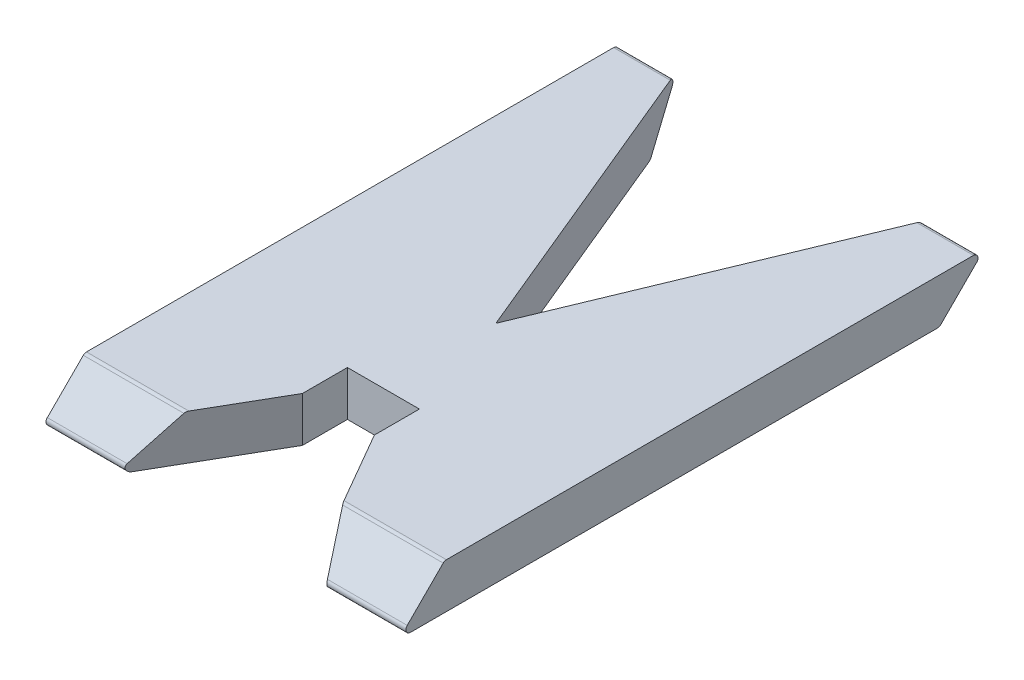
ISO-10303-21;
HEADER;
FILE_DESCRIPTION(('STEP AP214'),'2;1');
FILE_NAME('part.step','',(''),(''),'','','');
FILE_SCHEMA(('AUTOMOTIVE_DESIGN { 1 0 10303 214 1 1 1 1 }'));
ENDSEC;
DATA;
#1=APPLICATION_CONTEXT('core data for automotive mechanical design processes');
#2=APPLICATION_PROTOCOL_DEFINITION('international standard','automotive_design',2000,#1);
#3=PRODUCT_CONTEXT('',#1,'mechanical');
#4=PRODUCT('Part','Part','',(#3));
#5=PRODUCT_RELATED_PRODUCT_CATEGORY('part','',(#4));
#6=PRODUCT_DEFINITION_FORMATION('','',#4);
#7=PRODUCT_DEFINITION_CONTEXT('part definition',#1,'design');
#8=PRODUCT_DEFINITION('design','',#6,#7);
#9=PRODUCT_DEFINITION_SHAPE('','',#8);
#10=(LENGTH_UNIT() NAMED_UNIT(*) SI_UNIT(.MILLI.,.METRE.));
#11=(NAMED_UNIT(*) PLANE_ANGLE_UNIT() SI_UNIT($,.RADIAN.));
#12=(NAMED_UNIT(*) SI_UNIT($,.STERADIAN.) SOLID_ANGLE_UNIT());
#13=UNCERTAINTY_MEASURE_WITH_UNIT(LENGTH_MEASURE(1.E-05),#10,'distance_accuracy_value','');
#14=(GEOMETRIC_REPRESENTATION_CONTEXT(3) GLOBAL_UNCERTAINTY_ASSIGNED_CONTEXT((#13)) GLOBAL_UNIT_ASSIGNED_CONTEXT((#10,
#11,#12)) REPRESENTATION_CONTEXT('',''));
#15=CARTESIAN_POINT('',(0.,0.,0.));
#16=DIRECTION('',(0.,0.,1.));
#17=DIRECTION('',(1.,0.,0.));
#18=AXIS2_PLACEMENT_3D('',#15,#16,#17);
#19=CARTESIAN_POINT('',(0.,10.,-10.));
#20=DIRECTION('',(0.,0.707106781186547,0.707106781186549));
#21=DIRECTION('',(-1.,0.,0.));
#22=AXIS2_PLACEMENT_3D('',#19,#20,#21);
#23=PLANE('',#22);
#24=DIRECTION('',(-0.377964473009225,0.654653670707979,-0.654653670707977));
#25=VECTOR('',#24,1.);
#26=CARTESIAN_POINT('',(49.2657862446619,24.221807475097,-24.2218074750969));
#27=LINE('',#26,#25);
#28=CARTESIAN_POINT('',(62.2646547510148,1.70710678118655,-1.70710678118658));
#29=VERTEX_POINT('',#28);
#30=CARTESIAN_POINT('',(57.6458525974978,9.70710678118655,-9.70710678118656));
#31=VERTEX_POINT('',#30);
#32=EDGE_CURVE('E285',#29,#31,#27,.T.);
#33=ORIENTED_EDGE('',*,*,#32,.F.);
#34=DIRECTION('',(1.,0.,0.));
#35=VECTOR('',#34,1.);
#36=CARTESIAN_POINT('',(80.,1.70710678118655,-1.70710678118658));
#37=LINE('',#36,#35);
#38=CARTESIAN_POINT('',(80.,1.70710678118655,-1.70710678118658));
#39=VERTEX_POINT('',#38);
#40=EDGE_CURVE('E315',#29,#39,#37,.T.);
#41=ORIENTED_EDGE('',*,*,#40,.T.);
#42=DIRECTION('',(0.,-0.707106781186549,0.707106781186547));
#43=VECTOR('',#42,1.);
#44=CARTESIAN_POINT('',(80.,10.,-10.));
#45=LINE('',#44,#43);
#46=CARTESIAN_POINT('',(80.,9.70710678118655,-9.70710678118656));
#47=VERTEX_POINT('',#46);
#48=EDGE_CURVE('E301',#47,#39,#45,.T.);
#49=ORIENTED_EDGE('',*,*,#48,.F.);
#50=DIRECTION('',(1.,0.,0.));
#51=VECTOR('',#50,1.);
#52=CARTESIAN_POINT('',(0.,9.70710678118655,-9.70710678118656));
#53=LINE('',#52,#51);
#54=EDGE_CURVE('E338',#47,#31,#53,.F.);
#55=ORIENTED_EDGE('',*,*,#54,.T.);
#56=EDGE_LOOP('',(#33,#41,#49,#55));
#57=FACE_BOUND('',#56,.T.);
#58=ADVANCED_FACE('F47',(#57),#23,.T.);
#59=CARTESIAN_POINT('',(0.,1.,-2.41421356237313));
#60=DIRECTION('',(-1.,0.,0.));
#61=DIRECTION('',(0.,0.,1.));
#62=AXIS2_PLACEMENT_3D('',#59,#60,#61);
#63=CYLINDRICAL_SURFACE('',#62,1.);
#64=CARTESIAN_POINT('',(61.8564064605509,1.,-2.41421356237313));
#65=DIRECTION('',(0.86602540378444,0.,-0.499999999999998));
#66=DIRECTION('',(-0.499999999999998,0.,-0.86602540378444));
#67=AXIS2_PLACEMENT_3D('',#64,#65,#66);
#68=ELLIPSE('',#67,1.15470053837925,1.);
#69=CARTESIAN_POINT('',(61.8564064605509,0.,-2.41421356237313));
#70=VERTEX_POINT('',#69);
#71=EDGE_CURVE('E288',#70,#29,#68,.F.);
#72=ORIENTED_EDGE('',*,*,#71,.F.);
#73=DIRECTION('',(1.,0.,0.));
#74=VECTOR('',#73,1.);
#75=CARTESIAN_POINT('',(0.,0.,-2.41421356237313));
#76=LINE('',#75,#74);
#77=CARTESIAN_POINT('',(80.,0.,-2.41421356237313));
#78=VERTEX_POINT('',#77);
#79=EDGE_CURVE('E324',#78,#70,#76,.F.);
#80=ORIENTED_EDGE('',*,*,#79,.F.);
#81=CARTESIAN_POINT('',(80.,1.,-2.41421356237313));
#82=DIRECTION('',(-1.,0.,0.));
#83=DIRECTION('',(0.,0.,1.));
#84=AXIS2_PLACEMENT_3D('',#81,#82,#83);
#85=CIRCLE('',#84,1.);
#86=EDGE_CURVE('E320',#39,#78,#85,.F.);
#87=ORIENTED_EDGE('',*,*,#86,.F.);
#88=ORIENTED_EDGE('',*,*,#40,.F.);
#89=EDGE_LOOP('',(#72,#80,#87,#88));
#90=FACE_BOUND('',#89,.T.);
#91=ADVANCED_FACE('F418',(#90),#63,.T.);
#92=CARTESIAN_POINT('',(0.,9.,-10.4142135623731));
#93=DIRECTION('',(1.,0.,0.));
#94=DIRECTION('',(0.,0.,-1.));
#95=AXIS2_PLACEMENT_3D('',#92,#93,#94);
#96=CYLINDRICAL_SURFACE('',#95,1.);
#97=CARTESIAN_POINT('',(57.237604307034,9.,-10.4142135623731));
#98=DIRECTION('',(0.86602540378444,0.,-0.499999999999998));
#99=DIRECTION('',(0.499999999999998,0.,0.86602540378444));
#100=AXIS2_PLACEMENT_3D('',#97,#98,#99);
#101=ELLIPSE('',#100,1.15470053837925,1.);
#102=CARTESIAN_POINT('',(57.237604307034,10.,-10.4142135623731));
#103=VERTEX_POINT('',#102);
#104=EDGE_CURVE('E11',#31,#103,#101,.F.);
#105=ORIENTED_EDGE('',*,*,#104,.F.);
#106=ORIENTED_EDGE('',*,*,#54,.F.);
#107=CARTESIAN_POINT('',(80.,9.,-10.4142135623731));
#108=DIRECTION('',(-1.,0.,0.));
#109=DIRECTION('',(0.,0.,1.));
#110=AXIS2_PLACEMENT_3D('',#107,#108,#109);
#111=CIRCLE('',#110,1.);
#112=CARTESIAN_POINT('',(80.,10.,-10.4142135623731));
#113=VERTEX_POINT('',#112);
#114=EDGE_CURVE('E334',#113,#47,#111,.F.);
#115=ORIENTED_EDGE('',*,*,#114,.F.);
#116=DIRECTION('',(1.,0.,0.));
#117=VECTOR('',#116,1.);
#118=CARTESIAN_POINT('',(0.,10.,-10.4142135623731));
#119=LINE('',#118,#117);
#120=EDGE_CURVE('E331',#103,#113,#119,.T.);
#121=ORIENTED_EDGE('',*,*,#120,.F.);
#122=EDGE_LOOP('',(#105,#106,#115,#121));
#123=FACE_BOUND('',#122,.T.);
#124=ADVANCED_FACE('F475',(#123),#96,.T.);
#125=CARTESIAN_POINT('',(0.,0.,-120.));
#126=DIRECTION('',(0.,-0.707106781186547,-0.707106781186548));
#127=DIRECTION('',(-1.,0.,0.));
#128=AXIS2_PLACEMENT_3D('',#125,#126,#127);
#129=PLANE('',#128);
#130=DIRECTION('',(-0.281084637714818,0.678598344545848,-0.678598344545847));
#131=VECTOR('',#130,1.);
#132=CARTESIAN_POINT('',(14.4899329647434,3.00096337593684,-123.000963375937));
#133=LINE('',#132,#131);
#134=CARTESIAN_POINT('',(15.6116523516818,0.292893218813456,-120.292893218813));
#135=VERTEX_POINT('',#134);
#136=CARTESIAN_POINT('',(12.297943852697,8.29289321881346,-128.292893218813));
#137=VERTEX_POINT('',#136);
#138=EDGE_CURVE('E272',#135,#137,#133,.T.);
#139=ORIENTED_EDGE('',*,*,#138,.F.);
#140=DIRECTION('',(1.,0.,0.));
#141=VECTOR('',#140,1.);
#142=CARTESIAN_POINT('',(0.,0.292893218813456,-120.292893218813));
#143=LINE('',#142,#141);
#144=CARTESIAN_POINT('',(0.,0.292893218813463,-120.292893218813));
#145=VERTEX_POINT('',#144);
#146=EDGE_CURVE('E361',#135,#145,#143,.F.);
#147=ORIENTED_EDGE('',*,*,#146,.T.);
#148=DIRECTION('',(0.,-0.707106781186548,0.707106781186547));
#149=VECTOR('',#148,1.);
#150=CARTESIAN_POINT('',(0.,-55.,-65.0000000000001));
#151=LINE('',#150,#149);
#152=CARTESIAN_POINT('',(0.,8.29289321881346,-128.292893218813));
#153=VERTEX_POINT('',#152);
#154=EDGE_CURVE('E349',#153,#145,#151,.T.);
#155=ORIENTED_EDGE('',*,*,#154,.F.);
#156=DIRECTION('',(1.,0.,0.));
#157=VECTOR('',#156,1.);
#158=CARTESIAN_POINT('',(0.,8.29289321881346,-128.292893218813));
#159=LINE('',#158,#157);
#160=EDGE_CURVE('E370',#153,#137,#159,.T.);
#161=ORIENTED_EDGE('',*,*,#160,.T.);
#162=EDGE_LOOP('',(#139,#147,#155,#161));
#163=FACE_BOUND('',#162,.T.);
#164=ADVANCED_FACE('F462',(#163),#129,.T.);
#165=CARTESIAN_POINT('',(0.,1.,-119.585786437627));
#166=DIRECTION('',(-1.,0.,0.));
#167=DIRECTION('',(0.,0.,1.));
#168=AXIS2_PLACEMENT_3D('',#165,#166,#167);
#169=CYLINDRICAL_SURFACE('',#168,1.);
#170=CARTESIAN_POINT('',(15.9045455704952,1.,-119.585786437627));
#171=DIRECTION('',(-0.923879532511288,0.,0.382683432365087));
#172=DIRECTION('',(-0.382683432365087,0.,-0.923879532511288));
#173=AXIS2_PLACEMENT_3D('',#170,#171,#172);
#174=ELLIPSE('',#173,1.08239220029239,1.);
#175=CARTESIAN_POINT('',(15.9045455704952,0.,-119.585786437627));
#176=VERTEX_POINT('',#175);
#177=EDGE_CURVE('E275',#176,#135,#174,.F.);
#178=ORIENTED_EDGE('',*,*,#177,.F.);
#179=DIRECTION('',(1.,0.,0.));
#180=VECTOR('',#179,1.);
#181=CARTESIAN_POINT('',(80.,0.,-119.585786437627));
#182=LINE('',#181,#180);
#183=CARTESIAN_POINT('',(0.,0.,-119.585786437627));
#184=VERTEX_POINT('',#183);
#185=EDGE_CURVE('E354',#184,#176,#182,.T.);
#186=ORIENTED_EDGE('',*,*,#185,.F.);
#187=CARTESIAN_POINT('',(0.,1.,-119.585786437627));
#188=DIRECTION('',(-1.,0.,0.));
#189=DIRECTION('',(0.,0.,1.));
#190=AXIS2_PLACEMENT_3D('',#187,#188,#189);
#191=CIRCLE('',#190,1.);
#192=EDGE_CURVE('E366',#145,#184,#191,.T.);
#193=ORIENTED_EDGE('',*,*,#192,.F.);
#194=ORIENTED_EDGE('',*,*,#146,.F.);
#195=EDGE_LOOP('',(#178,#186,#193,#194));
#196=FACE_BOUND('',#195,.T.);
#197=ADVANCED_FACE('F446',(#196),#169,.T.);
#198=CARTESIAN_POINT('',(0.,9.,-127.585786437627));
#199=DIRECTION('',(1.,0.,0.));
#200=DIRECTION('',(0.,0.,-1.));
#201=AXIS2_PLACEMENT_3D('',#198,#199,#200);
#202=CYLINDRICAL_SURFACE('',#201,1.);
#203=DIRECTION('',(1.,0.,0.));
#204=VECTOR('',#203,1.);
#205=CARTESIAN_POINT('',(0.,10.,-127.585786437627));
#206=LINE('',#205,#204);
#207=CARTESIAN_POINT('',(12.5908370715105,10.,-127.585786437627));
#208=VERTEX_POINT('',#207);
#209=CARTESIAN_POINT('',(0.,10.,-127.585786437627));
#210=VERTEX_POINT('',#209);
#211=EDGE_CURVE('E377',#208,#210,#206,.F.);
#212=ORIENTED_EDGE('',*,*,#211,.F.);
#213=CARTESIAN_POINT('',(12.5908370715105,9.,-127.585786437627));
#214=DIRECTION('',(-0.923879532511288,0.,0.382683432365087));
#215=DIRECTION('',(0.382683432365087,0.,0.923879532511288));
#216=AXIS2_PLACEMENT_3D('',#213,#214,#215);
#217=ELLIPSE('',#216,1.08239220029239,1.);
#218=EDGE_CURVE('E388',#137,#208,#217,.F.);
#219=ORIENTED_EDGE('',*,*,#218,.F.);
#220=ORIENTED_EDGE('',*,*,#160,.F.);
#221=CARTESIAN_POINT('',(0.,9.,-127.585786437627));
#222=DIRECTION('',(-1.,0.,0.));
#223=DIRECTION('',(0.,0.,1.));
#224=AXIS2_PLACEMENT_3D('',#221,#222,#223);
#225=CIRCLE('',#224,1.);
#226=EDGE_CURVE('E382',#210,#153,#225,.T.);
#227=ORIENTED_EDGE('',*,*,#226,.F.);
#228=EDGE_LOOP('',(#212,#219,#220,#227));
#229=FACE_BOUND('',#228,.T.);
#230=ADVANCED_FACE('F461',(#229),#202,.T.);
#231=CARTESIAN_POINT('',(80.,10.,0.));
#232=DIRECTION('',(-1.,0.,0.));
#233=DIRECTION('',(0.,0.,1.));
#234=AXIS2_PLACEMENT_3D('',#231,#232,#233);
#235=PLANE('',#234);
#236=DIRECTION('',(0.,0.707106781186548,-0.707106781186547));
#237=VECTOR('',#236,1.);
#238=CARTESIAN_POINT('',(80.,0.,-120.));
#239=LINE('',#238,#237);
#240=CARTESIAN_POINT('',(80.,0.292893218813456,-120.292893218813));
#241=VERTEX_POINT('',#240);
#242=CARTESIAN_POINT('',(80.,8.29289321881346,-128.292893218813));
#243=VERTEX_POINT('',#242);
#244=EDGE_CURVE('E345',#241,#243,#239,.T.);
#245=ORIENTED_EDGE('',*,*,#244,.T.);
#246=CARTESIAN_POINT('',(80.,9.,-127.585786437627));
#247=DIRECTION('',(-1.,0.,0.));
#248=DIRECTION('',(0.,0.,1.));
#249=AXIS2_PLACEMENT_3D('',#246,#247,#248);
#250=CIRCLE('',#249,1.);
#251=CARTESIAN_POINT('',(80.,10.,-127.585786437627));
#252=VERTEX_POINT('',#251);
#253=EDGE_CURVE('E374',#243,#252,#250,.F.);
#254=ORIENTED_EDGE('',*,*,#253,.T.);
#255=DIRECTION('',(0.,0.,-1.));
#256=VECTOR('',#255,1.);
#257=CARTESIAN_POINT('',(80.,10.,0.));
#258=LINE('',#257,#256);
#259=EDGE_CURVE('E292',#113,#252,#258,.T.);
#260=ORIENTED_EDGE('',*,*,#259,.F.);
#261=ORIENTED_EDGE('',*,*,#114,.T.);
#262=ORIENTED_EDGE('',*,*,#48,.T.);
#263=ORIENTED_EDGE('',*,*,#86,.T.);
#264=DIRECTION('',(0.,0.,-1.));
#265=VECTOR('',#264,1.);
#266=CARTESIAN_POINT('',(80.,0.,0.));
#267=LINE('',#266,#265);
#268=CARTESIAN_POINT('',(80.,0.,-119.585786437627));
#269=VERTEX_POINT('',#268);
#270=EDGE_CURVE('E291',#78,#269,#267,.T.);
#271=ORIENTED_EDGE('',*,*,#270,.T.);
#272=CARTESIAN_POINT('',(80.,1.,-119.585786437627));
#273=DIRECTION('',(-1.,0.,0.));
#274=DIRECTION('',(0.,0.,1.));
#275=AXIS2_PLACEMENT_3D('',#272,#273,#274);
#276=CIRCLE('',#275,1.);
#277=EDGE_CURVE('E358',#269,#241,#276,.F.);
#278=ORIENTED_EDGE('',*,*,#277,.T.);
#279=EDGE_LOOP('',(#245,#254,#260,#261,#262,#263,#271,#278));
#280=FACE_BOUND('',#279,.T.);
#281=ADVANCED_FACE('F413',(#280),#235,.F.);
#282=CARTESIAN_POINT('',(0.,10.,0.));
#283=DIRECTION('',(-1.,0.,0.));
#284=DIRECTION('',(0.,0.,1.));
#285=AXIS2_PLACEMENT_3D('',#282,#283,#284);
#286=PLANE('',#285);
#287=DIRECTION('',(0.,0.,-1.));
#288=VECTOR('',#287,1.);
#289=CARTESIAN_POINT('',(0.,10.,0.));
#290=LINE('',#289,#288);
#291=CARTESIAN_POINT('',(0.,10.,-10.4142135623731));
#292=VERTEX_POINT('',#291);
#293=EDGE_CURVE('E296',#292,#210,#290,.T.);
#294=ORIENTED_EDGE('',*,*,#293,.T.);
#295=ORIENTED_EDGE('',*,*,#226,.T.);
#296=ORIENTED_EDGE('',*,*,#154,.T.);
#297=ORIENTED_EDGE('',*,*,#192,.T.);
#298=DIRECTION('',(0.,0.,-1.));
#299=VECTOR('',#298,1.);
#300=CARTESIAN_POINT('',(0.,0.,0.));
#301=LINE('',#300,#299);
#302=CARTESIAN_POINT('',(0.,0.,-2.41421356237313));
#303=VERTEX_POINT('',#302);
#304=EDGE_CURVE('E297',#303,#184,#301,.T.);
#305=ORIENTED_EDGE('',*,*,#304,.F.);
#306=CARTESIAN_POINT('',(0.,1.,-2.41421356237313));
#307=DIRECTION('',(-1.,0.,0.));
#308=DIRECTION('',(0.,0.,1.));
#309=AXIS2_PLACEMENT_3D('',#306,#307,#308);
#310=CIRCLE('',#309,1.);
#311=CARTESIAN_POINT('',(0.,1.70710678118655,-1.70710678118658));
#312=VERTEX_POINT('',#311);
#313=EDGE_CURVE('E328',#303,#312,#310,.T.);
#314=ORIENTED_EDGE('',*,*,#313,.T.);
#315=DIRECTION('',(0.,0.707106781186549,-0.707106781186547));
#316=VECTOR('',#315,1.);
#317=CARTESIAN_POINT('',(0.,4.99999999999999,-5.00000000000002));
#318=LINE('',#317,#316);
#319=CARTESIAN_POINT('',(0.,9.70710678118655,-9.70710678118656));
#320=VERTEX_POINT('',#319);
#321=EDGE_CURVE('E311',#312,#320,#318,.T.);
#322=ORIENTED_EDGE('',*,*,#321,.T.);
#323=CARTESIAN_POINT('',(0.,9.,-10.4142135623731));
#324=DIRECTION('',(-1.,0.,0.));
#325=DIRECTION('',(0.,0.,1.));
#326=AXIS2_PLACEMENT_3D('',#323,#324,#325);
#327=CIRCLE('',#326,1.);
#328=EDGE_CURVE('E342',#320,#292,#327,.T.);
#329=ORIENTED_EDGE('',*,*,#328,.T.);
#330=EDGE_LOOP('',(#294,#295,#296,#297,#305,#314,#322,#329));
#331=FACE_BOUND('',#330,.T.);
#332=ADVANCED_FACE('F459',(#331),#286,.T.);
#333=CARTESIAN_POINT('',(0.,10.,0.));
#334=DIRECTION('',(0.,1.,0.));
#335=DIRECTION('',(0.,0.,1.));
#336=AXIS2_PLACEMENT_3D('',#333,#334,#335);
#337=PLANE('',#336);
#338=DIRECTION('',(0.499999999999998,0.,0.86602540378444));
#339=VECTOR('',#338,1.);
#340=CARTESIAN_POINT('',(48.,10.,-26.4142135623731));
#341=LINE('',#340,#339);
#342=CARTESIAN_POINT('',(48.,10.,-26.4142135623731));
#343=VERTEX_POINT('',#342);
#344=EDGE_CURVE('E198',#343,#103,#341,.T.);
#345=ORIENTED_EDGE('',*,*,#344,.T.);
#346=ORIENTED_EDGE('',*,*,#120,.T.);
#347=ORIENTED_EDGE('',*,*,#259,.T.);
#348=CARTESIAN_POINT('',(67.4091629284896,10.,-127.585786437627));
#349=VERTEX_POINT('',#348);
#350=EDGE_CURVE('E378',#252,#349,#206,.F.);
#351=ORIENTED_EDGE('',*,*,#350,.T.);
#352=DIRECTION('',(-0.382683432365087,0.,0.923879532511288));
#353=VECTOR('',#352,1.);
#354=CARTESIAN_POINT('',(40.,10.,-61.4142135623731));
#355=LINE('',#354,#353);
#356=CARTESIAN_POINT('',(40.,10.,-61.4142135623731));
#357=VERTEX_POINT('',#356);
#358=EDGE_CURVE('E71',#349,#357,#355,.T.);
#359=ORIENTED_EDGE('',*,*,#358,.T.);
#360=DIRECTION('',(-0.382683432365087,0.,-0.923879532511288));
#361=VECTOR('',#360,1.);
#362=CARTESIAN_POINT('',(12.1766235091374,10.,-128.585786437627));
#363=LINE('',#362,#361);
#364=EDGE_CURVE('E256',#357,#208,#363,.T.);
#365=ORIENTED_EDGE('',*,*,#364,.T.);
#366=ORIENTED_EDGE('',*,*,#211,.T.);
#367=ORIENTED_EDGE('',*,*,#293,.F.);
#368=CARTESIAN_POINT('',(22.762395692966,10.,-10.4142135623731));
#369=VERTEX_POINT('',#368);
#370=EDGE_CURVE('E214',#292,#369,#119,.T.);
#371=ORIENTED_EDGE('',*,*,#370,.T.);
#372=DIRECTION('',(0.499999999999998,0.,-0.86602540378444));
#373=VECTOR('',#372,1.);
#374=CARTESIAN_POINT('',(17.5662432702594,10.,-1.41421356237312));
#375=LINE('',#374,#373);
#376=CARTESIAN_POINT('',(32.,10.,-26.4142135623731));
#377=VERTEX_POINT('',#376);
#378=EDGE_CURVE('E63',#369,#377,#375,.T.);
#379=ORIENTED_EDGE('',*,*,#378,.T.);
#380=DIRECTION('',(0.,0.,-1.));
#381=VECTOR('',#380,1.);
#382=CARTESIAN_POINT('',(32.,10.,-26.4142135623731));
#383=LINE('',#382,#381);
#384=CARTESIAN_POINT('',(32.,10.,-36.4142135623731));
#385=VERTEX_POINT('',#384);
#386=EDGE_CURVE('E201',#377,#385,#383,.T.);
#387=ORIENTED_EDGE('',*,*,#386,.T.);
#388=DIRECTION('',(1.,0.,0.));
#389=VECTOR('',#388,1.);
#390=CARTESIAN_POINT('',(32.,10.,-36.4142135623731));
#391=LINE('',#390,#389);
#392=CARTESIAN_POINT('',(48.,10.,-36.4142135623731));
#393=VERTEX_POINT('',#392);
#394=EDGE_CURVE('E207',#385,#393,#391,.T.);
#395=ORIENTED_EDGE('',*,*,#394,.T.);
#396=DIRECTION('',(0.,0.,1.));
#397=VECTOR('',#396,1.);
#398=CARTESIAN_POINT('',(48.,10.,-36.4142135623731));
#399=LINE('',#398,#397);
#400=EDGE_CURVE('E224',#393,#343,#399,.T.);
#401=ORIENTED_EDGE('',*,*,#400,.T.);
#402=EDGE_LOOP('',(#345,#346,#347,#351,#359,#365,#366,#367,#371,#379,#387,#395,#401));
#403=FACE_BOUND('',#402,.T.);
#404=ADVANCED_FACE('F211',(#403),#337,.T.);
#405=CARTESIAN_POINT('',(0.,0.,0.));
#406=DIRECTION('',(0.,1.,0.));
#407=DIRECTION('',(0.,0.,1.));
#408=AXIS2_PLACEMENT_3D('',#405,#406,#407);
#409=PLANE('',#408);
#410=ORIENTED_EDGE('',*,*,#79,.T.);
#411=DIRECTION('',(0.499999999999998,0.,0.86602540378444));
#412=VECTOR('',#411,1.);
#413=CARTESIAN_POINT('',(48.,0.,-26.4142135623731));
#414=LINE('',#413,#412);
#415=CARTESIAN_POINT('',(48.,0.,-26.4142135623731));
#416=VERTEX_POINT('',#415);
#417=EDGE_CURVE('E216',#416,#70,#414,.T.);
#418=ORIENTED_EDGE('',*,*,#417,.F.);
#419=DIRECTION('',(0.,0.,1.));
#420=VECTOR('',#419,1.);
#421=CARTESIAN_POINT('',(48.,0.,-36.4142135623731));
#422=LINE('',#421,#420);
#423=CARTESIAN_POINT('',(48.,0.,-36.4142135623731));
#424=VERTEX_POINT('',#423);
#425=EDGE_CURVE('E219',#424,#416,#422,.T.);
#426=ORIENTED_EDGE('',*,*,#425,.F.);
#427=DIRECTION('',(1.,0.,0.));
#428=VECTOR('',#427,1.);
#429=CARTESIAN_POINT('',(32.,0.,-36.4142135623731));
#430=LINE('',#429,#428);
#431=CARTESIAN_POINT('',(32.,0.,-36.4142135623731));
#432=VERTEX_POINT('',#431);
#433=EDGE_CURVE('E236',#432,#424,#430,.T.);
#434=ORIENTED_EDGE('',*,*,#433,.F.);
#435=DIRECTION('',(0.,0.,-1.));
#436=VECTOR('',#435,1.);
#437=CARTESIAN_POINT('',(32.,0.,-26.4142135623731));
#438=LINE('',#437,#436);
#439=CARTESIAN_POINT('',(32.,0.,-26.4142135623731));
#440=VERTEX_POINT('',#439);
#441=EDGE_CURVE('E232',#440,#432,#438,.T.);
#442=ORIENTED_EDGE('',*,*,#441,.F.);
#443=DIRECTION('',(0.499999999999998,0.,-0.86602540378444));
#444=VECTOR('',#443,1.);
#445=CARTESIAN_POINT('',(17.5662432702594,0.,-1.41421356237312));
#446=LINE('',#445,#444);
#447=CARTESIAN_POINT('',(18.1435935394491,0.,-2.41421356237313));
#448=VERTEX_POINT('',#447);
#449=EDGE_CURVE('E192',#448,#440,#446,.T.);
#450=ORIENTED_EDGE('',*,*,#449,.F.);
#451=EDGE_CURVE('E323',#448,#303,#76,.F.);
#452=ORIENTED_EDGE('',*,*,#451,.T.);
#453=ORIENTED_EDGE('',*,*,#304,.T.);
#454=ORIENTED_EDGE('',*,*,#185,.T.);
#455=DIRECTION('',(-0.382683432365087,0.,-0.923879532511288));
#456=VECTOR('',#455,1.);
#457=CARTESIAN_POINT('',(12.1766235091374,0.,-128.585786437627));
#458=LINE('',#457,#456);
#459=CARTESIAN_POINT('',(40.,0.,-61.4142135623731));
#460=VERTEX_POINT('',#459);
#461=EDGE_CURVE('E257',#460,#176,#458,.T.);
#462=ORIENTED_EDGE('',*,*,#461,.F.);
#463=DIRECTION('',(-0.382683432365087,0.,0.923879532511288));
#464=VECTOR('',#463,1.);
#465=CARTESIAN_POINT('',(40.,0.,-61.4142135623731));
#466=LINE('',#465,#464);
#467=CARTESIAN_POINT('',(64.0954544295048,0.,-119.585786437627));
#468=VERTEX_POINT('',#467);
#469=EDGE_CURVE('E233',#468,#460,#466,.T.);
#470=ORIENTED_EDGE('',*,*,#469,.F.);
#471=EDGE_CURVE('E353',#468,#269,#182,.T.);
#472=ORIENTED_EDGE('',*,*,#471,.T.);
#473=ORIENTED_EDGE('',*,*,#270,.F.);
#474=EDGE_LOOP('',(#410,#418,#426,#434,#442,#450,#452,#453,#454,#462,#470,#472,#473));
#475=FACE_BOUND('',#474,.T.);
#476=ADVANCED_FACE('F421',(#475),#409,.F.);
#477=DIRECTION('',(-0.377964473009225,-0.654653670707979,0.654653670707977));
#478=VECTOR('',#477,1.);
#479=CARTESIAN_POINT('',(19.3056423267668,4.42694110288129,-4.42694110288132));
#480=LINE('',#479,#478);
#481=CARTESIAN_POINT('',(22.3541474025022,9.70710678118655,-9.70710678118656));
#482=VERTEX_POINT('',#481);
#483=CARTESIAN_POINT('',(17.7353452489852,1.70710678118655,-1.70710678118658));
#484=VERTEX_POINT('',#483);
#485=EDGE_CURVE('E278',#482,#484,#480,.T.);
#486=ORIENTED_EDGE('',*,*,#485,.F.);
#487=EDGE_CURVE('E337',#482,#320,#53,.F.);
#488=ORIENTED_EDGE('',*,*,#487,.T.);
#489=ORIENTED_EDGE('',*,*,#321,.F.);
#490=EDGE_CURVE('E316',#312,#484,#37,.T.);
#491=ORIENTED_EDGE('',*,*,#490,.T.);
#492=EDGE_LOOP('',(#486,#488,#489,#491));
#493=FACE_BOUND('',#492,.T.);
#494=ADVANCED_FACE('F395',(#493),#23,.T.);
#495=CARTESIAN_POINT('',(18.1435935394491,1.,-2.41421356237313));
#496=DIRECTION('',(-0.86602540378444,0.,-0.499999999999998));
#497=DIRECTION('',(-0.499999999999998,0.,0.86602540378444));
#498=AXIS2_PLACEMENT_3D('',#495,#496,#497);
#499=ELLIPSE('',#498,1.15470053837925,1.);
#500=EDGE_CURVE('E282',#484,#448,#499,.F.);
#501=ORIENTED_EDGE('',*,*,#500,.F.);
#502=ORIENTED_EDGE('',*,*,#490,.F.);
#503=ORIENTED_EDGE('',*,*,#313,.F.);
#504=ORIENTED_EDGE('',*,*,#451,.F.);
#505=EDGE_LOOP('',(#501,#502,#503,#504));
#506=FACE_BOUND('',#505,.T.);
#507=ADVANCED_FACE('F467',(#506),#63,.T.);
#508=CARTESIAN_POINT('',(22.762395692966,9.,-10.4142135623731));
#509=DIRECTION('',(-0.86602540378444,0.,-0.499999999999998));
#510=DIRECTION('',(0.499999999999998,0.,-0.86602540378444));
#511=AXIS2_PLACEMENT_3D('',#508,#509,#510);
#512=ELLIPSE('',#511,1.15470053837925,1.);
#513=EDGE_CURVE('E56',#369,#482,#512,.F.);
#514=ORIENTED_EDGE('',*,*,#513,.F.);
#515=ORIENTED_EDGE('',*,*,#370,.F.);
#516=ORIENTED_EDGE('',*,*,#328,.F.);
#517=ORIENTED_EDGE('',*,*,#487,.F.);
#518=EDGE_LOOP('',(#514,#515,#516,#517));
#519=FACE_BOUND('',#518,.T.);
#520=ADVANCED_FACE('F399',(#519),#96,.T.);
#521=DIRECTION('',(-0.281084637714818,-0.678598344545848,0.678598344545847));
#522=VECTOR('',#521,1.);
#523=CARTESIAN_POINT('',(59.1893811505149,-12.2585222105068,-107.741477789493));
#524=LINE('',#523,#522);
#525=CARTESIAN_POINT('',(67.702056147303,8.29289321881346,-128.292893218813));
#526=VERTEX_POINT('',#525);
#527=CARTESIAN_POINT('',(64.3883476483183,0.292893218813456,-120.292893218813));
#528=VERTEX_POINT('',#527);
#529=EDGE_CURVE('E246',#526,#528,#524,.T.);
#530=ORIENTED_EDGE('',*,*,#529,.F.);
#531=EDGE_CURVE('E369',#526,#243,#159,.T.);
#532=ORIENTED_EDGE('',*,*,#531,.T.);
#533=ORIENTED_EDGE('',*,*,#244,.F.);
#534=EDGE_CURVE('E362',#241,#528,#143,.F.);
#535=ORIENTED_EDGE('',*,*,#534,.T.);
#536=EDGE_LOOP('',(#530,#532,#533,#535));
#537=FACE_BOUND('',#536,.T.);
#538=ADVANCED_FACE('F431',(#537),#129,.T.);
#539=CARTESIAN_POINT('',(64.0954544295048,1.,-119.585786437627));
#540=DIRECTION('',(0.923879532511288,0.,0.382683432365087));
#541=DIRECTION('',(-0.382683432365087,0.,0.923879532511288));
#542=AXIS2_PLACEMENT_3D('',#539,#540,#541);
#543=ELLIPSE('',#542,1.08239220029239,1.);
#544=EDGE_CURVE('E269',#528,#468,#543,.F.);
#545=ORIENTED_EDGE('',*,*,#544,.F.);
#546=ORIENTED_EDGE('',*,*,#534,.F.);
#547=ORIENTED_EDGE('',*,*,#277,.F.);
#548=ORIENTED_EDGE('',*,*,#471,.F.);
#549=EDGE_LOOP('',(#545,#546,#547,#548));
#550=FACE_BOUND('',#549,.T.);
#551=ADVANCED_FACE('F435',(#550),#169,.T.);
#552=ORIENTED_EDGE('',*,*,#531,.F.);
#553=CARTESIAN_POINT('',(67.4091629284896,9.,-127.585786437627));
#554=DIRECTION('',(0.923879532511288,0.,0.382683432365087));
#555=DIRECTION('',(0.382683432365087,0.,-0.923879532511288));
#556=AXIS2_PLACEMENT_3D('',#553,#554,#555);
#557=ELLIPSE('',#556,1.08239220029239,1.);
#558=EDGE_CURVE('E385',#349,#526,#557,.F.);
#559=ORIENTED_EDGE('',*,*,#558,.F.);
#560=ORIENTED_EDGE('',*,*,#350,.F.);
#561=ORIENTED_EDGE('',*,*,#253,.F.);
#562=EDGE_LOOP('',(#552,#559,#560,#561));
#563=FACE_BOUND('',#562,.T.);
#564=ADVANCED_FACE('F49',(#563),#202,.T.);
#565=CARTESIAN_POINT('',(12.1766235091374,10.,-128.585786437627));
#566=DIRECTION('',(-0.923879532511288,0.,0.382683432365087));
#567=DIRECTION('',(0.382683432365087,0.,0.923879532511288));
#568=AXIS2_PLACEMENT_3D('',#565,#566,#567);
#569=PLANE('',#568);
#570=ORIENTED_EDGE('',*,*,#177,.T.);
#571=ORIENTED_EDGE('',*,*,#138,.T.);
#572=ORIENTED_EDGE('',*,*,#218,.T.);
#573=ORIENTED_EDGE('',*,*,#364,.F.);
#574=DIRECTION('',(0.,-1.,0.));
#575=VECTOR('',#574,1.);
#576=CARTESIAN_POINT('',(40.,10.,-61.4142135623731));
#577=LINE('',#576,#575);
#578=EDGE_CURVE('E252',#357,#460,#577,.T.);
#579=ORIENTED_EDGE('',*,*,#578,.T.);
#580=ORIENTED_EDGE('',*,*,#461,.T.);
#581=EDGE_LOOP('',(#570,#571,#572,#573,#579,#580));
#582=FACE_BOUND('',#581,.T.);
#583=ADVANCED_FACE('F441',(#582),#569,.F.);
#584=CARTESIAN_POINT('',(40.,10.,-61.4142135623731));
#585=DIRECTION('',(0.923879532511288,0.,0.382683432365087));
#586=DIRECTION('',(0.382683432365087,0.,-0.923879532511288));
#587=AXIS2_PLACEMENT_3D('',#584,#585,#586);
#588=PLANE('',#587);
#589=ORIENTED_EDGE('',*,*,#544,.T.);
#590=ORIENTED_EDGE('',*,*,#469,.T.);
#591=ORIENTED_EDGE('',*,*,#578,.F.);
#592=ORIENTED_EDGE('',*,*,#358,.F.);
#593=ORIENTED_EDGE('',*,*,#558,.T.);
#594=ORIENTED_EDGE('',*,*,#529,.T.);
#595=EDGE_LOOP('',(#589,#590,#591,#592,#593,#594));
#596=FACE_BOUND('',#595,.T.);
#597=ADVANCED_FACE('F436',(#596),#588,.F.);
#598=CARTESIAN_POINT('',(48.,10.,-26.4142135623731));
#599=DIRECTION('',(0.86602540378444,0.,-0.499999999999998));
#600=DIRECTION('',(-0.499999999999998,0.,-0.86602540378444));
#601=AXIS2_PLACEMENT_3D('',#598,#599,#600);
#602=PLANE('',#601);
#603=ORIENTED_EDGE('',*,*,#71,.T.);
#604=ORIENTED_EDGE('',*,*,#32,.T.);
#605=ORIENTED_EDGE('',*,*,#104,.T.);
#606=ORIENTED_EDGE('',*,*,#344,.F.);
#607=DIRECTION('',(0.,-1.,0.));
#608=VECTOR('',#607,1.);
#609=CARTESIAN_POINT('',(48.,10.,-26.4142135623731));
#610=LINE('',#609,#608);
#611=EDGE_CURVE('E243',#343,#416,#610,.T.);
#612=ORIENTED_EDGE('',*,*,#611,.T.);
#613=ORIENTED_EDGE('',*,*,#417,.T.);
#614=EDGE_LOOP('',(#603,#604,#605,#606,#612,#613));
#615=FACE_BOUND('',#614,.T.);
#616=ADVANCED_FACE('F498',(#615),#602,.F.);
#617=CARTESIAN_POINT('',(48.,10.,-36.4142135623731));
#618=DIRECTION('',(1.,0.,0.));
#619=DIRECTION('',(0.,0.,-1.));
#620=AXIS2_PLACEMENT_3D('',#617,#618,#619);
#621=PLANE('',#620);
#622=ORIENTED_EDGE('',*,*,#425,.T.);
#623=ORIENTED_EDGE('',*,*,#611,.F.);
#624=ORIENTED_EDGE('',*,*,#400,.F.);
#625=DIRECTION('',(0.,-1.,0.));
#626=VECTOR('',#625,1.);
#627=CARTESIAN_POINT('',(48.,10.,-36.4142135623731));
#628=LINE('',#627,#626);
#629=EDGE_CURVE('E247',#393,#424,#628,.T.);
#630=ORIENTED_EDGE('',*,*,#629,.T.);
#631=EDGE_LOOP('',(#622,#623,#624,#630));
#632=FACE_BOUND('',#631,.T.);
#633=ADVANCED_FACE('F506',(#632),#621,.F.);
#634=CARTESIAN_POINT('',(32.,10.,-36.4142135623731));
#635=DIRECTION('',(0.,0.,-1.));
#636=DIRECTION('',(-1.,0.,0.));
#637=AXIS2_PLACEMENT_3D('',#634,#635,#636);
#638=PLANE('',#637);
#639=ORIENTED_EDGE('',*,*,#433,.T.);
#640=ORIENTED_EDGE('',*,*,#629,.F.);
#641=ORIENTED_EDGE('',*,*,#394,.F.);
#642=DIRECTION('',(0.,-1.,0.));
#643=VECTOR('',#642,1.);
#644=CARTESIAN_POINT('',(32.,10.,-36.4142135623731));
#645=LINE('',#644,#643);
#646=EDGE_CURVE('E197',#385,#432,#645,.T.);
#647=ORIENTED_EDGE('',*,*,#646,.T.);
#648=EDGE_LOOP('',(#639,#640,#641,#647));
#649=FACE_BOUND('',#648,.T.);
#650=ADVANCED_FACE('F503',(#649),#638,.F.);
#651=CARTESIAN_POINT('',(32.,10.,-26.4142135623731));
#652=DIRECTION('',(-1.,0.,0.));
#653=DIRECTION('',(0.,0.,1.));
#654=AXIS2_PLACEMENT_3D('',#651,#652,#653);
#655=PLANE('',#654);
#656=ORIENTED_EDGE('',*,*,#441,.T.);
#657=ORIENTED_EDGE('',*,*,#646,.F.);
#658=ORIENTED_EDGE('',*,*,#386,.F.);
#659=DIRECTION('',(0.,-1.,0.));
#660=VECTOR('',#659,1.);
#661=CARTESIAN_POINT('',(32.,10.,-26.4142135623731));
#662=LINE('',#661,#660);
#663=EDGE_CURVE('E188',#377,#440,#662,.T.);
#664=ORIENTED_EDGE('',*,*,#663,.T.);
#665=EDGE_LOOP('',(#656,#657,#658,#664));
#666=FACE_BOUND('',#665,.T.);
#667=ADVANCED_FACE('F202',(#666),#655,.F.);
#668=CARTESIAN_POINT('',(17.5662432702594,10.,-1.41421356237312));
#669=DIRECTION('',(-0.86602540378444,0.,-0.499999999999998));
#670=DIRECTION('',(-0.499999999999998,0.,0.86602540378444));
#671=AXIS2_PLACEMENT_3D('',#668,#669,#670);
#672=PLANE('',#671);
#673=ORIENTED_EDGE('',*,*,#500,.T.);
#674=ORIENTED_EDGE('',*,*,#449,.T.);
#675=ORIENTED_EDGE('',*,*,#663,.F.);
#676=ORIENTED_EDGE('',*,*,#378,.F.);
#677=ORIENTED_EDGE('',*,*,#513,.T.);
#678=ORIENTED_EDGE('',*,*,#485,.T.);
#679=EDGE_LOOP('',(#673,#674,#675,#676,#677,#678));
#680=FACE_BOUND('',#679,.T.);
#681=ADVANCED_FACE('F190',(#680),#672,.F.);
#682=CLOSED_SHELL('',(#58,#91,#124,#164,#197,#230,#281,#332,#404,#476,#494,#507,#520,#538,#551,
#564,#583,#597,#616,#633,#650,#667,#681));
#683=MANIFOLD_SOLID_BREP('B2',#682);
#684=ADVANCED_BREP_SHAPE_REPRESENTATION('',(#18,#683),#14);
#685=SHAPE_DEFINITION_REPRESENTATION(#9,#684);
ENDSEC;
END-ISO-10303-21;
